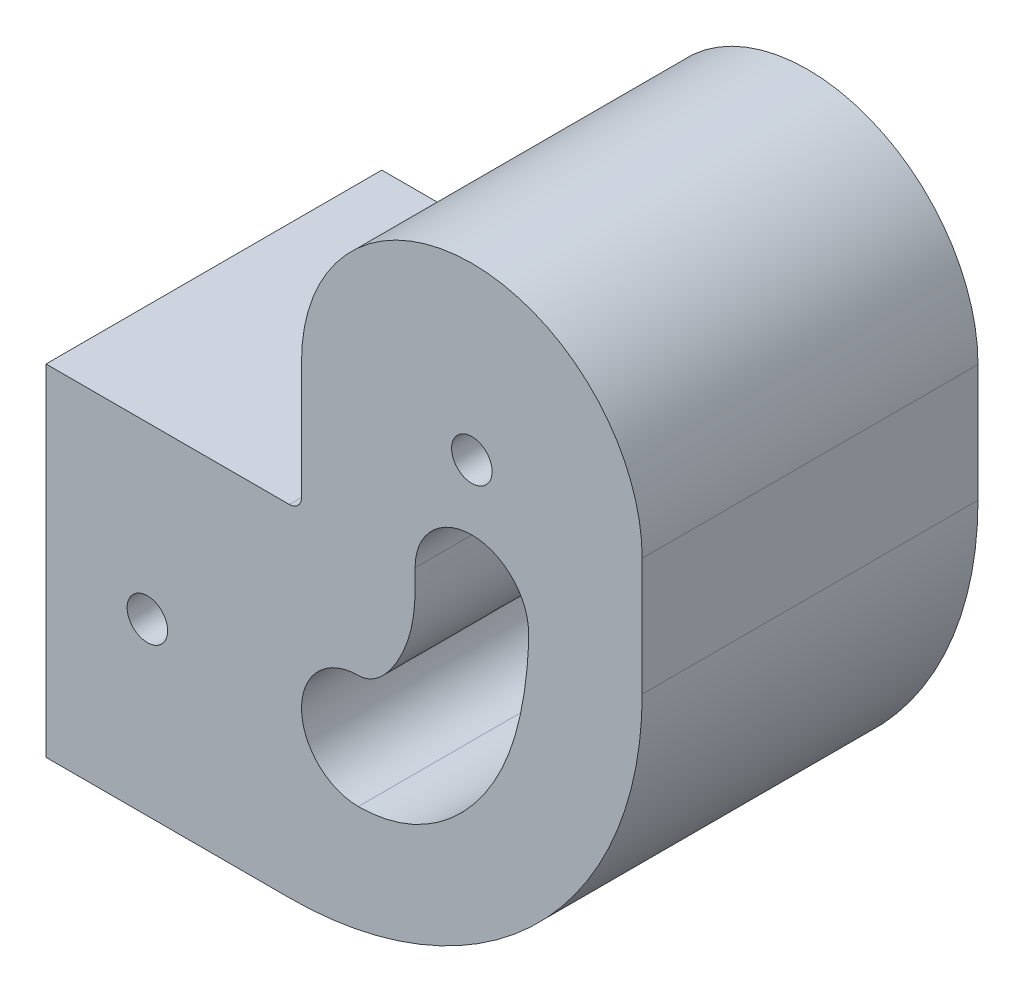
ISO-10303-21;
HEADER;
FILE_DESCRIPTION(('STEP AP214'),'2;1');
FILE_NAME('part.step','',(''),(''),'','','');
FILE_SCHEMA(('AUTOMOTIVE_DESIGN { 1 0 10303 214 1 1 1 1 }'));
ENDSEC;
DATA;
#1=APPLICATION_CONTEXT('core data for automotive mechanical design processes');
#2=APPLICATION_PROTOCOL_DEFINITION('international standard','automotive_design',2000,#1);
#3=PRODUCT_CONTEXT('',#1,'mechanical');
#4=PRODUCT('Part','Part','',(#3));
#5=PRODUCT_RELATED_PRODUCT_CATEGORY('part','',(#4));
#6=PRODUCT_DEFINITION_FORMATION('','',#4);
#7=PRODUCT_DEFINITION_CONTEXT('part definition',#1,'design');
#8=PRODUCT_DEFINITION('design','',#6,#7);
#9=PRODUCT_DEFINITION_SHAPE('','',#8);
#10=(LENGTH_UNIT() NAMED_UNIT(*) SI_UNIT(.MILLI.,.METRE.));
#11=(NAMED_UNIT(*) PLANE_ANGLE_UNIT() SI_UNIT($,.RADIAN.));
#12=(NAMED_UNIT(*) SI_UNIT($,.STERADIAN.) SOLID_ANGLE_UNIT());
#13=UNCERTAINTY_MEASURE_WITH_UNIT(LENGTH_MEASURE(1.E-05),#10,'distance_accuracy_value','');
#14=(GEOMETRIC_REPRESENTATION_CONTEXT(3) GLOBAL_UNCERTAINTY_ASSIGNED_CONTEXT((#13)) GLOBAL_UNIT_ASSIGNED_CONTEXT((#10,
#11,#12)) REPRESENTATION_CONTEXT('',''));
#15=CARTESIAN_POINT('',(0.,0.,0.));
#16=DIRECTION('',(0.,0.,1.));
#17=DIRECTION('',(1.,0.,0.));
#18=AXIS2_PLACEMENT_3D('',#15,#16,#17);
#19=CARTESIAN_POINT('',(-9.37448476169282,10.7481097822781,41.4));
#20=DIRECTION('',(0.,0.,-1.));
#21=DIRECTION('',(-1.,0.,0.));
#22=AXIS2_PLACEMENT_3D('',#19,#20,#21);
#23=CYLINDRICAL_SURFACE('',#22,2.5);
#24=CARTESIAN_POINT('',(-9.37448476169282,10.7481097822781,41.4));
#25=DIRECTION('',(0.,0.,1.));
#26=DIRECTION('',(1.,0.,0.));
#27=AXIS2_PLACEMENT_3D('',#24,#25,#26);
#28=CIRCLE('',#27,2.5);
#29=CARTESIAN_POINT('',(-6.87448476169282,10.7481097822781,41.4));
#30=VERTEX_POINT('',#29);
#31=EDGE_CURVE('E222',#30,#30,#28,.T.);
#32=ORIENTED_EDGE('',*,*,#31,.T.);
#33=EDGE_LOOP('',(#32));
#34=FACE_BOUND('',#33,.T.);
#35=CARTESIAN_POINT('',(-9.37448476169282,10.7481097822781,34.1));
#36=DIRECTION('',(0.,0.,-1.));
#37=DIRECTION('',(-1.,0.,0.));
#38=AXIS2_PLACEMENT_3D('',#35,#36,#37);
#39=CIRCLE('',#38,2.5);
#40=CARTESIAN_POINT('',(-11.8744847616928,10.7481097822781,34.1));
#41=VERTEX_POINT('',#40);
#42=EDGE_CURVE('E423',#41,#41,#39,.T.);
#43=ORIENTED_EDGE('',*,*,#42,.T.);
#44=EDGE_LOOP('',(#43));
#45=FACE_BOUND('',#44,.T.);
#46=ADVANCED_FACE('F33',(#34,#45),#23,.F.);
#47=CARTESIAN_POINT('',(-9.37448476169282,10.7481097822781,7.7));
#48=DIRECTION('',(0.,0.,-1.));
#49=DIRECTION('',(0.,1.,0.));
#50=AXIS2_PLACEMENT_3D('',#47,#48,#49);
#51=CIRCLE('',#50,2.5);
#52=CARTESIAN_POINT('',(-9.37448476169282,13.2481097822781,7.7));
#53=VERTEX_POINT('',#52);
#54=EDGE_CURVE('E37',#53,#53,#51,.T.);
#55=ORIENTED_EDGE('',*,*,#54,.F.);
#56=EDGE_LOOP('',(#55));
#57=FACE_BOUND('',#56,.T.);
#58=CARTESIAN_POINT('',(-9.37448476169282,10.7481097822781,0.));
#59=DIRECTION('',(0.,0.,1.));
#60=DIRECTION('',(1.,0.,0.));
#61=AXIS2_PLACEMENT_3D('',#58,#59,#60);
#62=CIRCLE('',#61,2.5);
#63=CARTESIAN_POINT('',(-6.87448476169282,10.7481097822781,0.));
#64=VERTEX_POINT('',#63);
#65=EDGE_CURVE('E218',#64,#64,#62,.T.);
#66=ORIENTED_EDGE('',*,*,#65,.F.);
#67=EDGE_LOOP('',(#66));
#68=FACE_BOUND('',#67,.T.);
#69=ADVANCED_FACE('F331',(#57,#68),#23,.F.);
#70=CARTESIAN_POINT('',(8.12551523830717,33.2481097822781,41.4));
#71=DIRECTION('',(0.,0.,1.));
#72=DIRECTION('',(1.,0.,0.));
#73=AXIS2_PLACEMENT_3D('',#70,#71,#72);
#74=PLANE('',#73);
#75=CARTESIAN_POINT('',(23.6255152383072,32.7481097822781,41.4));
#76=CARTESIAN_POINT('',(23.6255152383072,30.3988147346227,41.4));
#77=CARTESIAN_POINT('',(23.8825667910086,24.826419711627,41.4));
#78=CARTESIAN_POINT('',(19.461751307427,17.7481097822781,41.4));
#79=CARTESIAN_POINT('',(16.6255152383072,17.7481097822781,41.4));
#80=B_SPLINE_CURVE_WITH_KNOTS('',3,(#75,#76,#77,#78,#79),.UNSPECIFIED.,.F.,.F.,(4,1,4),(0.,
0.428336813074137,1.),.UNSPECIFIED.);
#81=CARTESIAN_POINT('',(23.6255152383072,32.7481097822781,41.4));
#82=VERTEX_POINT('',#81);
#83=CARTESIAN_POINT('',(16.6255152383072,17.7481097822781,41.4));
#84=VERTEX_POINT('',#83);
#85=EDGE_CURVE('E49',#82,#84,#80,.T.);
#86=ORIENTED_EDGE('',*,*,#85,.F.);
#87=CARTESIAN_POINT('',(30.6255152383072,32.7481097822781,41.4));
#88=DIRECTION('',(0.,0.,1.));
#89=DIRECTION('',(-1.,0.,0.));
#90=AXIS2_PLACEMENT_3D('',#87,#88,#89);
#91=CIRCLE('',#90,7.);
#92=CARTESIAN_POINT('',(37.6255152383072,32.7481097822781,41.4));
#93=VERTEX_POINT('',#92);
#94=EDGE_CURVE('E166',#93,#82,#91,.T.);
#95=ORIENTED_EDGE('',*,*,#94,.F.);
#96=CARTESIAN_POINT('',(16.6255152383072,3.74810978227806,41.4));
#97=CARTESIAN_POINT('',(24.9405095952387,3.74810978227806,41.4));
#98=CARTESIAN_POINT('',(36.1710874523953,14.120308293446,41.4));
#99=CARTESIAN_POINT('',(37.6255152383072,29.3528395495759,41.4));
#100=CARTESIAN_POINT('',(37.6255152383072,32.7481097822781,41.4));
#101=B_SPLINE_CURVE_WITH_KNOTS('',3,(#96,#97,#98,#99,#100),.UNSPECIFIED.,.F.,.F.,(4,1,4),(0.,
0.619735212235577,1.),.UNSPECIFIED.);
#102=CARTESIAN_POINT('',(16.6255152383072,3.74810978227806,41.4));
#103=VERTEX_POINT('',#102);
#104=EDGE_CURVE('E150',#103,#93,#101,.T.);
#105=ORIENTED_EDGE('',*,*,#104,.F.);
#106=CARTESIAN_POINT('',(16.6255152383072,10.7481097822781,41.4));
#107=DIRECTION('',(0.,0.,1.));
#108=DIRECTION('',(1.,0.,0.));
#109=AXIS2_PLACEMENT_3D('',#106,#107,#108);
#110=CIRCLE('',#109,7.);
#111=EDGE_CURVE('E159',#84,#103,#110,.T.);
#112=ORIENTED_EDGE('',*,*,#111,.F.);
#113=EDGE_LOOP('',(#86,#95,#105,#112));
#114=FACE_BOUND('',#113,.T.);
#115=ORIENTED_EDGE('',*,*,#31,.F.);
#116=EDGE_LOOP('',(#115));
#117=FACE_BOUND('',#116,.T.);
#118=CARTESIAN_POINT('',(8.12551523830717,33.2481097822781,41.4));
#119=DIRECTION('',(0.,0.,-1.));
#120=DIRECTION('',(1.,0.,0.));
#121=AXIS2_PLACEMENT_3D('',#118,#119,#120);
#122=CIRCLE('',#121,1.50000000000002);
#123=CARTESIAN_POINT('',(9.62551523830719,33.2481097822781,41.4));
#124=VERTEX_POINT('',#123);
#125=CARTESIAN_POINT('',(8.12551523830717,31.7481097822781,41.4));
#126=VERTEX_POINT('',#125);
#127=EDGE_CURVE('E228',#124,#126,#122,.T.);
#128=ORIENTED_EDGE('',*,*,#127,.T.);
#129=DIRECTION('',(-1.,0.,0.));
#130=VECTOR('',#129,1.);
#131=CARTESIAN_POINT('',(8.12551523830717,31.7481097822781,41.4));
#132=LINE('',#131,#130);
#133=CARTESIAN_POINT('',(-21.8744847616928,31.7481097822781,41.4));
#134=VERTEX_POINT('',#133);
#135=EDGE_CURVE('E231',#126,#134,#132,.T.);
#136=ORIENTED_EDGE('',*,*,#135,.T.);
#137=DIRECTION('',(0.,-1.,0.));
#138=VECTOR('',#137,1.);
#139=CARTESIAN_POINT('',(-21.8744847616928,31.7481097822781,41.4));
#140=LINE('',#139,#138);
#141=CARTESIAN_POINT('',(-21.8744847616928,-10.2518902177219,41.4));
#142=VERTEX_POINT('',#141);
#143=EDGE_CURVE('E234',#134,#142,#140,.T.);
#144=ORIENTED_EDGE('',*,*,#143,.T.);
#145=DIRECTION('',(1.,0.,0.));
#146=VECTOR('',#145,1.);
#147=CARTESIAN_POINT('',(-21.8744847616928,-10.2518902177219,41.4));
#148=LINE('',#147,#146);
#149=CARTESIAN_POINT('',(8.12551523830718,-10.2518902177219,41.4));
#150=VERTEX_POINT('',#149);
#151=EDGE_CURVE('E236',#142,#150,#148,.T.);
#152=ORIENTED_EDGE('',*,*,#151,.T.);
#153=CARTESIAN_POINT('',(8.12551523830717,33.2481097822781,41.4));
#154=DIRECTION('',(0.,0.,1.));
#155=DIRECTION('',(1.,0.,0.));
#156=AXIS2_PLACEMENT_3D('',#153,#154,#155);
#157=CIRCLE('',#156,43.5);
#158=CARTESIAN_POINT('',(51.6255152383072,33.2481097822781,41.4));
#159=VERTEX_POINT('',#158);
#160=EDGE_CURVE('E238',#150,#159,#157,.T.);
#161=ORIENTED_EDGE('',*,*,#160,.T.);
#162=DIRECTION('',(0.,1.,0.));
#163=VECTOR('',#162,1.);
#164=CARTESIAN_POINT('',(51.6255152383072,47.7481097822781,41.4));
#165=LINE('',#164,#163);
#166=CARTESIAN_POINT('',(51.6255152383072,47.7481097822781,41.4));
#167=VERTEX_POINT('',#166);
#168=EDGE_CURVE('E240',#159,#167,#165,.T.);
#169=ORIENTED_EDGE('',*,*,#168,.T.);
#170=CARTESIAN_POINT('',(30.6255152383072,47.7481097822781,41.4));
#171=DIRECTION('',(0.,0.,1.));
#172=DIRECTION('',(-1.,0.,0.));
#173=AXIS2_PLACEMENT_3D('',#170,#171,#172);
#174=CIRCLE('',#173,21.);
#175=CARTESIAN_POINT('',(9.62551523830718,47.7481097822781,41.4));
#176=VERTEX_POINT('',#175);
#177=EDGE_CURVE('E242',#167,#176,#174,.T.);
#178=ORIENTED_EDGE('',*,*,#177,.T.);
#179=DIRECTION('',(0.,-1.,0.));
#180=VECTOR('',#179,1.);
#181=CARTESIAN_POINT('',(9.62551523830719,47.7481097822781,41.4));
#182=LINE('',#181,#180);
#183=EDGE_CURVE('E244',#176,#124,#182,.T.);
#184=ORIENTED_EDGE('',*,*,#183,.T.);
#185=EDGE_LOOP('',(#128,#136,#144,#152,#161,#169,#178,#184));
#186=FACE_BOUND('',#185,.T.);
#187=CARTESIAN_POINT('',(30.6255152383072,47.7481097822781,41.4));
#188=DIRECTION('',(0.,0.,1.));
#189=DIRECTION('',(1.,0.,0.));
#190=AXIS2_PLACEMENT_3D('',#187,#188,#189);
#191=CIRCLE('',#190,2.5);
#192=CARTESIAN_POINT('',(33.1255152383072,47.7481097822781,41.4));
#193=VERTEX_POINT('',#192);
#194=EDGE_CURVE('E215',#193,#193,#191,.T.);
#195=ORIENTED_EDGE('',*,*,#194,.F.);
#196=EDGE_LOOP('',(#195));
#197=FACE_BOUND('',#196,.T.);
#198=ADVANCED_FACE('F163',(#114,#117,#186,#197),#74,.T.);
#199=CARTESIAN_POINT('',(8.12551523830717,33.2481097822781,0.));
#200=DIRECTION('',(0.,0.,1.));
#201=DIRECTION('',(1.,0.,0.));
#202=AXIS2_PLACEMENT_3D('',#199,#200,#201);
#203=PLANE('',#202);
#204=CARTESIAN_POINT('',(30.6255152383072,32.7481097822781,0.));
#205=DIRECTION('',(0.,0.,1.));
#206=DIRECTION('',(1.,0.,0.));
#207=AXIS2_PLACEMENT_3D('',#204,#205,#206);
#208=CIRCLE('',#207,7.);
#209=CARTESIAN_POINT('',(23.6255152383072,32.7481097822781,0.));
#210=VERTEX_POINT('',#209);
#211=CARTESIAN_POINT('',(37.6255152383072,32.7481097822781,0.));
#212=VERTEX_POINT('',#211);
#213=EDGE_CURVE('E428',#210,#212,#208,.F.);
#214=ORIENTED_EDGE('',*,*,#213,.F.);
#215=CARTESIAN_POINT('',(23.6255152383072,32.7481097822781,0.));
#216=CARTESIAN_POINT('',(23.6255152383072,30.3988147346227,0.));
#217=CARTESIAN_POINT('',(23.8825667910086,24.826419711627,0.));
#218=CARTESIAN_POINT('',(19.461751307427,17.7481097822781,0.));
#219=CARTESIAN_POINT('',(16.6255152383072,17.7481097822781,0.));
#220=B_SPLINE_CURVE_WITH_KNOTS('',3,(#215,#216,#217,#218,#219),.UNSPECIFIED.,.F.,.F.,(4,1,4),
(0.,0.428336813074137,1.),.UNSPECIFIED.);
#221=CARTESIAN_POINT('',(16.6255152383072,17.7481097822781,0.));
#222=VERTEX_POINT('',#221);
#223=EDGE_CURVE('E183',#222,#210,#220,.F.);
#224=ORIENTED_EDGE('',*,*,#223,.F.);
#225=CARTESIAN_POINT('',(16.6255152383072,10.7481097822781,0.));
#226=DIRECTION('',(0.,0.,1.));
#227=DIRECTION('',(1.,0.,0.));
#228=AXIS2_PLACEMENT_3D('',#225,#226,#227);
#229=CIRCLE('',#228,7.);
#230=CARTESIAN_POINT('',(16.6255152383072,3.74810978227806,0.));
#231=VERTEX_POINT('',#230);
#232=EDGE_CURVE('E180',#231,#222,#229,.F.);
#233=ORIENTED_EDGE('',*,*,#232,.F.);
#234=CARTESIAN_POINT('',(16.6255152383072,3.74810978227806,0.));
#235=CARTESIAN_POINT('',(24.9405095952387,3.74810978227806,0.));
#236=CARTESIAN_POINT('',(36.1710874523953,14.120308293446,0.));
#237=CARTESIAN_POINT('',(37.6255152383072,29.3528395495759,0.));
#238=CARTESIAN_POINT('',(37.6255152383072,32.7481097822781,0.));
#239=B_SPLINE_CURVE_WITH_KNOTS('',3,(#234,#235,#236,#237,#238),.UNSPECIFIED.,.F.,.F.,(4,1,4),
(0.,0.619735212235577,1.),.UNSPECIFIED.);
#240=EDGE_CURVE('E153',#212,#231,#239,.F.);
#241=ORIENTED_EDGE('',*,*,#240,.F.);
#242=EDGE_LOOP('',(#214,#224,#233,#241));
#243=FACE_BOUND('',#242,.T.);
#244=CARTESIAN_POINT('',(8.12551523830717,33.2481097822781,0.));
#245=DIRECTION('',(0.,0.,-1.));
#246=DIRECTION('',(1.,0.,0.));
#247=AXIS2_PLACEMENT_3D('',#244,#245,#246);
#248=CIRCLE('',#247,1.50000000000002);
#249=CARTESIAN_POINT('',(9.62551523830719,33.2481097822781,0.));
#250=VERTEX_POINT('',#249);
#251=CARTESIAN_POINT('',(8.12551523830717,31.7481097822781,0.));
#252=VERTEX_POINT('',#251);
#253=EDGE_CURVE('E225',#250,#252,#248,.T.);
#254=ORIENTED_EDGE('',*,*,#253,.F.);
#255=DIRECTION('',(0.,-1.,0.));
#256=VECTOR('',#255,1.);
#257=CARTESIAN_POINT('',(9.62551523830719,47.7481097822781,0.));
#258=LINE('',#257,#256);
#259=CARTESIAN_POINT('',(9.62551523830718,47.7481097822781,0.));
#260=VERTEX_POINT('',#259);
#261=EDGE_CURVE('E232',#260,#250,#258,.T.);
#262=ORIENTED_EDGE('',*,*,#261,.F.);
#263=CARTESIAN_POINT('',(30.6255152383072,47.7481097822781,0.));
#264=DIRECTION('',(0.,0.,1.));
#265=DIRECTION('',(-1.,0.,0.));
#266=AXIS2_PLACEMENT_3D('',#263,#264,#265);
#267=CIRCLE('',#266,21.);
#268=CARTESIAN_POINT('',(51.6255152383072,47.7481097822781,0.));
#269=VERTEX_POINT('',#268);
#270=EDGE_CURVE('E259',#269,#260,#267,.T.);
#271=ORIENTED_EDGE('',*,*,#270,.F.);
#272=DIRECTION('',(0.,1.,0.));
#273=VECTOR('',#272,1.);
#274=CARTESIAN_POINT('',(51.6255152383072,47.7481097822781,0.));
#275=LINE('',#274,#273);
#276=CARTESIAN_POINT('',(51.6255152383072,33.2481097822781,0.));
#277=VERTEX_POINT('',#276);
#278=EDGE_CURVE('E257',#277,#269,#275,.T.);
#279=ORIENTED_EDGE('',*,*,#278,.F.);
#280=CARTESIAN_POINT('',(8.12551523830717,33.2481097822781,0.));
#281=DIRECTION('',(0.,0.,1.));
#282=DIRECTION('',(1.,0.,0.));
#283=AXIS2_PLACEMENT_3D('',#280,#281,#282);
#284=CIRCLE('',#283,43.5);
#285=CARTESIAN_POINT('',(8.12551523830718,-10.2518902177219,0.));
#286=VERTEX_POINT('',#285);
#287=EDGE_CURVE('E255',#286,#277,#284,.T.);
#288=ORIENTED_EDGE('',*,*,#287,.F.);
#289=DIRECTION('',(1.,0.,0.));
#290=VECTOR('',#289,1.);
#291=CARTESIAN_POINT('',(-21.8744847616928,-10.2518902177219,0.));
#292=LINE('',#291,#290);
#293=CARTESIAN_POINT('',(-21.8744847616928,-10.2518902177219,0.));
#294=VERTEX_POINT('',#293);
#295=EDGE_CURVE('E253',#294,#286,#292,.T.);
#296=ORIENTED_EDGE('',*,*,#295,.F.);
#297=DIRECTION('',(0.,-1.,0.));
#298=VECTOR('',#297,1.);
#299=CARTESIAN_POINT('',(-21.8744847616928,31.7481097822781,0.));
#300=LINE('',#299,#298);
#301=CARTESIAN_POINT('',(-21.8744847616928,31.7481097822781,0.));
#302=VERTEX_POINT('',#301);
#303=EDGE_CURVE('E251',#302,#294,#300,.T.);
#304=ORIENTED_EDGE('',*,*,#303,.F.);
#305=DIRECTION('',(-1.,0.,0.));
#306=VECTOR('',#305,1.);
#307=CARTESIAN_POINT('',(8.12551523830717,31.7481097822781,0.));
#308=LINE('',#307,#306);
#309=EDGE_CURVE('E249',#252,#302,#308,.T.);
#310=ORIENTED_EDGE('',*,*,#309,.F.);
#311=EDGE_LOOP('',(#254,#262,#271,#279,#288,#296,#304,#310));
#312=FACE_BOUND('',#311,.T.);
#313=ORIENTED_EDGE('',*,*,#65,.T.);
#314=EDGE_LOOP('',(#313));
#315=FACE_BOUND('',#314,.T.);
#316=CARTESIAN_POINT('',(30.6255152383072,47.7481097822781,0.));
#317=DIRECTION('',(0.,0.,1.));
#318=DIRECTION('',(1.,0.,0.));
#319=AXIS2_PLACEMENT_3D('',#316,#317,#318);
#320=CIRCLE('',#319,2.5);
#321=CARTESIAN_POINT('',(33.1255152383072,47.7481097822781,0.));
#322=VERTEX_POINT('',#321);
#323=EDGE_CURVE('E219',#322,#322,#320,.T.);
#324=ORIENTED_EDGE('',*,*,#323,.T.);
#325=EDGE_LOOP('',(#324));
#326=FACE_BOUND('',#325,.T.);
#327=ADVANCED_FACE('F290',(#243,#312,#315,#326),#203,.F.);
#328=CARTESIAN_POINT('',(8.12551523830717,33.2481097822781,41.4));
#329=DIRECTION('',(0.,0.,-1.));
#330=DIRECTION('',(-1.,0.,0.));
#331=AXIS2_PLACEMENT_3D('',#328,#329,#330);
#332=CYLINDRICAL_SURFACE('',#331,1.50000000000002);
#333=ORIENTED_EDGE('',*,*,#253,.T.);
#334=DIRECTION('',(0.,0.,-1.));
#335=VECTOR('',#334,1.);
#336=CARTESIAN_POINT('',(8.12551523830717,31.7481097822781,41.4));
#337=LINE('',#336,#335);
#338=EDGE_CURVE('E11',#126,#252,#337,.T.);
#339=ORIENTED_EDGE('',*,*,#338,.F.);
#340=ORIENTED_EDGE('',*,*,#127,.F.);
#341=DIRECTION('',(0.,0.,-1.));
#342=VECTOR('',#341,1.);
#343=CARTESIAN_POINT('',(9.62551523830719,33.2481097822781,41.4));
#344=LINE('',#343,#342);
#345=EDGE_CURVE('E246',#124,#250,#344,.T.);
#346=ORIENTED_EDGE('',*,*,#345,.T.);
#347=EDGE_LOOP('',(#333,#339,#340,#346));
#348=FACE_BOUND('',#347,.T.);
#349=ADVANCED_FACE('F35',(#348),#332,.F.);
#350=CARTESIAN_POINT('',(8.12551523830717,31.7481097822781,41.4));
#351=DIRECTION('',(0.,-1.,0.));
#352=DIRECTION('',(1.,0.,0.));
#353=AXIS2_PLACEMENT_3D('',#350,#351,#352);
#354=PLANE('',#353);
#355=ORIENTED_EDGE('',*,*,#309,.T.);
#356=DIRECTION('',(0.,0.,-1.));
#357=VECTOR('',#356,1.);
#358=CARTESIAN_POINT('',(-21.8744847616928,31.7481097822781,41.4));
#359=LINE('',#358,#357);
#360=EDGE_CURVE('E42',#134,#302,#359,.T.);
#361=ORIENTED_EDGE('',*,*,#360,.F.);
#362=ORIENTED_EDGE('',*,*,#135,.F.);
#363=ORIENTED_EDGE('',*,*,#338,.T.);
#364=EDGE_LOOP('',(#355,#361,#362,#363));
#365=FACE_BOUND('',#364,.T.);
#366=ADVANCED_FACE('F308',(#365),#354,.F.);
#367=CARTESIAN_POINT('',(-21.8744847616928,31.7481097822781,41.4));
#368=DIRECTION('',(1.,0.,0.));
#369=DIRECTION('',(0.,1.,0.));
#370=AXIS2_PLACEMENT_3D('',#367,#368,#369);
#371=PLANE('',#370);
#372=DIRECTION('',(0.,0.,1.));
#373=VECTOR('',#372,1.);
#374=CARTESIAN_POINT('',(-21.8744847616928,-2.25189021772193,7.7));
#375=LINE('',#374,#373);
#376=CARTESIAN_POINT('',(-21.8744847616928,-2.25189021772193,7.70000000000001));
#377=VERTEX_POINT('',#376);
#378=CARTESIAN_POINT('',(-21.8744847616928,-2.25189021772193,33.7));
#379=VERTEX_POINT('',#378);
#380=EDGE_CURVE('E199',#377,#379,#375,.T.);
#381=ORIENTED_EDGE('',*,*,#380,.F.);
#382=DIRECTION('',(0.,-1.,0.));
#383=VECTOR('',#382,1.);
#384=CARTESIAN_POINT('',(-21.8744847616928,23.7481097822781,7.7));
#385=LINE('',#384,#383);
#386=CARTESIAN_POINT('',(-21.8744847616928,23.7481097822781,7.7));
#387=VERTEX_POINT('',#386);
#388=EDGE_CURVE('E182',#387,#377,#385,.T.);
#389=ORIENTED_EDGE('',*,*,#388,.F.);
#390=DIRECTION('',(0.,0.,-1.));
#391=VECTOR('',#390,1.);
#392=CARTESIAN_POINT('',(-21.8744847616928,23.7481097822781,7.7));
#393=LINE('',#392,#391);
#394=CARTESIAN_POINT('',(-21.8744847616928,23.7481097822781,33.7));
#395=VERTEX_POINT('',#394);
#396=EDGE_CURVE('E188',#395,#387,#393,.T.);
#397=ORIENTED_EDGE('',*,*,#396,.F.);
#398=DIRECTION('',(0.,1.,0.));
#399=VECTOR('',#398,1.);
#400=CARTESIAN_POINT('',(-21.8744847616928,23.7481097822781,33.7));
#401=LINE('',#400,#399);
#402=EDGE_CURVE('E202',#379,#395,#401,.T.);
#403=ORIENTED_EDGE('',*,*,#402,.F.);
#404=EDGE_LOOP('',(#381,#389,#397,#403));
#405=FACE_BOUND('',#404,.T.);
#406=ORIENTED_EDGE('',*,*,#303,.T.);
#407=DIRECTION('',(0.,0.,-1.));
#408=VECTOR('',#407,1.);
#409=CARTESIAN_POINT('',(-21.8744847616928,-10.2518902177219,41.4));
#410=LINE('',#409,#408);
#411=EDGE_CURVE('E276',#142,#294,#410,.T.);
#412=ORIENTED_EDGE('',*,*,#411,.F.);
#413=ORIENTED_EDGE('',*,*,#143,.F.);
#414=ORIENTED_EDGE('',*,*,#360,.T.);
#415=EDGE_LOOP('',(#406,#412,#413,#414));
#416=FACE_BOUND('',#415,.T.);
#417=ADVANCED_FACE('F284',(#405,#416),#371,.F.);
#418=CARTESIAN_POINT('',(-21.8744847616928,-10.2518902177219,41.4));
#419=DIRECTION('',(0.,1.,0.));
#420=DIRECTION('',(-1.,0.,0.));
#421=AXIS2_PLACEMENT_3D('',#418,#419,#420);
#422=PLANE('',#421);
#423=ORIENTED_EDGE('',*,*,#295,.T.);
#424=DIRECTION('',(0.,0.,-1.));
#425=VECTOR('',#424,1.);
#426=CARTESIAN_POINT('',(8.12551523830718,-10.2518902177219,41.4));
#427=LINE('',#426,#425);
#428=EDGE_CURVE('E273',#150,#286,#427,.T.);
#429=ORIENTED_EDGE('',*,*,#428,.F.);
#430=ORIENTED_EDGE('',*,*,#151,.F.);
#431=ORIENTED_EDGE('',*,*,#411,.T.);
#432=EDGE_LOOP('',(#423,#429,#430,#431));
#433=FACE_BOUND('',#432,.T.);
#434=ADVANCED_FACE('F296',(#433),#422,.F.);
#435=CARTESIAN_POINT('',(8.12551523830717,33.2481097822781,41.4));
#436=DIRECTION('',(0.,0.,-1.));
#437=DIRECTION('',(-1.,0.,0.));
#438=AXIS2_PLACEMENT_3D('',#435,#436,#437);
#439=CYLINDRICAL_SURFACE('',#438,43.5);
#440=ORIENTED_EDGE('',*,*,#287,.T.);
#441=DIRECTION('',(0.,0.,-1.));
#442=VECTOR('',#441,1.);
#443=CARTESIAN_POINT('',(51.6255152383072,33.2481097822781,41.4));
#444=LINE('',#443,#442);
#445=EDGE_CURVE('E270',#159,#277,#444,.T.);
#446=ORIENTED_EDGE('',*,*,#445,.F.);
#447=ORIENTED_EDGE('',*,*,#160,.F.);
#448=ORIENTED_EDGE('',*,*,#428,.T.);
#449=EDGE_LOOP('',(#440,#446,#447,#448));
#450=FACE_BOUND('',#449,.T.);
#451=ADVANCED_FACE('F300',(#450),#439,.T.);
#452=CARTESIAN_POINT('',(51.6255152383072,47.7481097822781,41.4));
#453=DIRECTION('',(-1.,0.,0.));
#454=DIRECTION('',(0.,0.,1.));
#455=AXIS2_PLACEMENT_3D('',#452,#453,#454);
#456=PLANE('',#455);
#457=ORIENTED_EDGE('',*,*,#278,.T.);
#458=DIRECTION('',(0.,0.,-1.));
#459=VECTOR('',#458,1.);
#460=CARTESIAN_POINT('',(51.6255152383072,47.7481097822781,41.4));
#461=LINE('',#460,#459);
#462=EDGE_CURVE('E267',#167,#269,#461,.T.);
#463=ORIENTED_EDGE('',*,*,#462,.F.);
#464=ORIENTED_EDGE('',*,*,#168,.F.);
#465=ORIENTED_EDGE('',*,*,#445,.T.);
#466=EDGE_LOOP('',(#457,#463,#464,#465));
#467=FACE_BOUND('',#466,.T.);
#468=ADVANCED_FACE('F321',(#467),#456,.F.);
#469=CARTESIAN_POINT('',(30.6255152383072,47.7481097822781,41.4));
#470=DIRECTION('',(0.,0.,-1.));
#471=DIRECTION('',(-1.,0.,0.));
#472=AXIS2_PLACEMENT_3D('',#469,#470,#471);
#473=CYLINDRICAL_SURFACE('',#472,21.);
#474=ORIENTED_EDGE('',*,*,#270,.T.);
#475=DIRECTION('',(0.,0.,-1.));
#476=VECTOR('',#475,1.);
#477=CARTESIAN_POINT('',(9.62551523830718,47.7481097822781,41.4));
#478=LINE('',#477,#476);
#479=EDGE_CURVE('E264',#176,#260,#478,.T.);
#480=ORIENTED_EDGE('',*,*,#479,.F.);
#481=ORIENTED_EDGE('',*,*,#177,.F.);
#482=ORIENTED_EDGE('',*,*,#462,.T.);
#483=EDGE_LOOP('',(#474,#480,#481,#482));
#484=FACE_BOUND('',#483,.T.);
#485=ADVANCED_FACE('F319',(#484),#473,.T.);
#486=CARTESIAN_POINT('',(9.62551523830719,47.7481097822781,41.4));
#487=DIRECTION('',(1.,0.,0.));
#488=DIRECTION('',(0.,0.,-1.));
#489=AXIS2_PLACEMENT_3D('',#486,#487,#488);
#490=PLANE('',#489);
#491=ORIENTED_EDGE('',*,*,#261,.T.);
#492=ORIENTED_EDGE('',*,*,#345,.F.);
#493=ORIENTED_EDGE('',*,*,#183,.F.);
#494=ORIENTED_EDGE('',*,*,#479,.T.);
#495=EDGE_LOOP('',(#491,#492,#493,#494));
#496=FACE_BOUND('',#495,.T.);
#497=ADVANCED_FACE('F314',(#496),#490,.F.);
#498=CARTESIAN_POINT('',(30.6255152383072,47.7481097822781,41.4));
#499=DIRECTION('',(0.,0.,-1.));
#500=DIRECTION('',(-1.,0.,0.));
#501=AXIS2_PLACEMENT_3D('',#498,#499,#500);
#502=CYLINDRICAL_SURFACE('',#501,2.5);
#503=ORIENTED_EDGE('',*,*,#194,.T.);
#504=EDGE_LOOP('',(#503));
#505=FACE_BOUND('',#504,.T.);
#506=ORIENTED_EDGE('',*,*,#323,.F.);
#507=EDGE_LOOP('',(#506));
#508=FACE_BOUND('',#507,.T.);
#509=ADVANCED_FACE('F343',(#505,#508),#502,.F.);
#510=CARTESIAN_POINT('',(9.12551523830718,23.7481097822781,7.7));
#511=DIRECTION('',(0.,0.,-1.));
#512=DIRECTION('',(0.,1.,0.));
#513=AXIS2_PLACEMENT_3D('',#510,#511,#512);
#514=PLANE('',#513);
#515=ORIENTED_EDGE('',*,*,#54,.T.);
#516=EDGE_LOOP('',(#515));
#517=FACE_BOUND('',#516,.T.);
#518=ORIENTED_EDGE('',*,*,#388,.T.);
#519=DIRECTION('',(-1.,0.,0.));
#520=VECTOR('',#519,1.);
#521=CARTESIAN_POINT('',(9.12551523830718,-2.25189021772193,7.7));
#522=LINE('',#521,#520);
#523=CARTESIAN_POINT('',(9.12551523830718,-2.25189021772193,7.7));
#524=VERTEX_POINT('',#523);
#525=EDGE_CURVE('E197',#524,#377,#522,.T.);
#526=ORIENTED_EDGE('',*,*,#525,.F.);
#527=DIRECTION('',(0.,-1.,0.));
#528=VECTOR('',#527,1.);
#529=CARTESIAN_POINT('',(9.12551523830718,23.7481097822781,7.7));
#530=LINE('',#529,#528);
#531=CARTESIAN_POINT('',(9.12551523830718,23.7481097822781,7.7));
#532=VERTEX_POINT('',#531);
#533=EDGE_CURVE('E184',#532,#524,#530,.T.);
#534=ORIENTED_EDGE('',*,*,#533,.F.);
#535=DIRECTION('',(-1.,0.,0.));
#536=VECTOR('',#535,1.);
#537=CARTESIAN_POINT('',(9.12551523830718,23.7481097822781,7.7));
#538=LINE('',#537,#536);
#539=EDGE_CURVE('E207',#532,#387,#538,.T.);
#540=ORIENTED_EDGE('',*,*,#539,.T.);
#541=EDGE_LOOP('',(#518,#526,#534,#540));
#542=FACE_BOUND('',#541,.T.);
#543=ADVANCED_FACE('F354',(#517,#542),#514,.F.);
#544=CARTESIAN_POINT('',(9.12551523830718,23.7481097822781,7.7));
#545=DIRECTION('',(0.,1.,0.));
#546=DIRECTION('',(-1.,0.,0.));
#547=AXIS2_PLACEMENT_3D('',#544,#545,#546);
#548=PLANE('',#547);
#549=ORIENTED_EDGE('',*,*,#396,.T.);
#550=ORIENTED_EDGE('',*,*,#539,.F.);
#551=DIRECTION('',(0.,0.,-1.));
#552=VECTOR('',#551,1.);
#553=CARTESIAN_POINT('',(9.12551523830718,23.7481097822781,7.7));
#554=LINE('',#553,#552);
#555=CARTESIAN_POINT('',(9.12551523830718,23.7481097822781,33.7));
#556=VERTEX_POINT('',#555);
#557=EDGE_CURVE('E194',#556,#532,#554,.T.);
#558=ORIENTED_EDGE('',*,*,#557,.F.);
#559=DIRECTION('',(-1.,0.,0.));
#560=VECTOR('',#559,1.);
#561=CARTESIAN_POINT('',(9.12551523830718,23.7481097822781,33.7));
#562=LINE('',#561,#560);
#563=EDGE_CURVE('E209',#556,#395,#562,.T.);
#564=ORIENTED_EDGE('',*,*,#563,.T.);
#565=EDGE_LOOP('',(#549,#550,#558,#564));
#566=FACE_BOUND('',#565,.T.);
#567=ADVANCED_FACE('F359',(#566),#548,.F.);
#568=CARTESIAN_POINT('',(9.12551523830718,23.7481097822781,33.7));
#569=DIRECTION('',(0.,0.,1.));
#570=DIRECTION('',(1.,0.,0.));
#571=AXIS2_PLACEMENT_3D('',#568,#569,#570);
#572=PLANE('',#571);
#573=ORIENTED_EDGE('',*,*,#402,.T.);
#574=ORIENTED_EDGE('',*,*,#563,.F.);
#575=DIRECTION('',(0.,1.,0.));
#576=VECTOR('',#575,1.);
#577=CARTESIAN_POINT('',(9.12551523830718,23.7481097822781,33.7));
#578=LINE('',#577,#576);
#579=CARTESIAN_POINT('',(9.12551523830718,-2.25189021772193,33.7));
#580=VERTEX_POINT('',#579);
#581=EDGE_CURVE('E191',#580,#556,#578,.T.);
#582=ORIENTED_EDGE('',*,*,#581,.F.);
#583=DIRECTION('',(-1.,0.,0.));
#584=VECTOR('',#583,1.);
#585=CARTESIAN_POINT('',(9.12551523830718,-2.25189021772193,33.7));
#586=LINE('',#585,#584);
#587=EDGE_CURVE('E211',#580,#379,#586,.T.);
#588=ORIENTED_EDGE('',*,*,#587,.T.);
#589=EDGE_LOOP('',(#573,#574,#582,#588));
#590=FACE_BOUND('',#589,.T.);
#591=ADVANCED_FACE('F368',(#590),#572,.F.);
#592=CARTESIAN_POINT('',(9.12551523830718,-2.25189021772193,7.7));
#593=DIRECTION('',(0.,-1.,0.));
#594=DIRECTION('',(1.,0.,0.));
#595=AXIS2_PLACEMENT_3D('',#592,#593,#594);
#596=PLANE('',#595);
#597=ORIENTED_EDGE('',*,*,#380,.T.);
#598=ORIENTED_EDGE('',*,*,#587,.F.);
#599=DIRECTION('',(0.,0.,1.));
#600=VECTOR('',#599,1.);
#601=CARTESIAN_POINT('',(9.12551523830718,-2.25189021772193,7.7));
#602=LINE('',#601,#600);
#603=EDGE_CURVE('E187',#524,#580,#602,.T.);
#604=ORIENTED_EDGE('',*,*,#603,.F.);
#605=ORIENTED_EDGE('',*,*,#525,.T.);
#606=EDGE_LOOP('',(#597,#598,#604,#605));
#607=FACE_BOUND('',#606,.T.);
#608=ADVANCED_FACE('F374',(#607),#596,.F.);
#609=CARTESIAN_POINT('',(9.12551523830718,0.,0.));
#610=DIRECTION('',(-1.,0.,0.));
#611=DIRECTION('',(0.,-1.,0.));
#612=AXIS2_PLACEMENT_3D('',#609,#610,#611);
#613=PLANE('',#612);
#614=ORIENTED_EDGE('',*,*,#533,.T.);
#615=ORIENTED_EDGE('',*,*,#603,.T.);
#616=ORIENTED_EDGE('',*,*,#581,.T.);
#617=ORIENTED_EDGE('',*,*,#557,.T.);
#618=EDGE_LOOP('',(#614,#615,#616,#617));
#619=FACE_BOUND('',#618,.T.);
#620=ADVANCED_FACE('F377',(#619),#613,.T.);
#621=CARTESIAN_POINT('',(23.6255152383072,32.7481097822781,-45.6070170039656));
#622=CARTESIAN_POINT('',(23.6255152383072,30.3988147346227,-45.6070170039656));
#623=CARTESIAN_POINT('',(23.8825667910086,24.826419711627,-45.6070170039656));
#624=CARTESIAN_POINT('',(19.461751307427,17.7481097822781,-45.6070170039656));
#625=CARTESIAN_POINT('',(16.6255152383072,17.7481097822781,-45.6070170039656));
#626=B_SPLINE_CURVE_WITH_KNOTS('',3,(#621,#622,#623,#624,#625),.UNSPECIFIED.,.F.,.F.,(4,1,4),
(0.,0.428336813074137,1.),.UNSPECIFIED.);
#627=DIRECTION('',(0.,0.,1.));
#628=VECTOR('',#627,1.);
#629=SURFACE_OF_LINEAR_EXTRUSION('',#626,#628);
#630=ORIENTED_EDGE('',*,*,#223,.T.);
#631=DIRECTION('',(0.,0.,1.));
#632=VECTOR('',#631,1.);
#633=CARTESIAN_POINT('',(23.6255152383072,32.7481097822781,-45.6070170039656));
#634=LINE('',#633,#632);
#635=EDGE_CURVE('E176',#210,#82,#634,.T.);
#636=ORIENTED_EDGE('',*,*,#635,.T.);
#637=ORIENTED_EDGE('',*,*,#85,.T.);
#638=DIRECTION('',(0.,0.,1.));
#639=VECTOR('',#638,1.);
#640=CARTESIAN_POINT('',(16.6255152383072,17.7481097822781,-45.6070170039656));
#641=LINE('',#640,#639);
#642=EDGE_CURVE('E156',#222,#84,#641,.T.);
#643=ORIENTED_EDGE('',*,*,#642,.F.);
#644=EDGE_LOOP('',(#630,#636,#637,#643));
#645=FACE_BOUND('',#644,.T.);
#646=ADVANCED_FACE('F384',(#645),#629,.F.);
#647=CARTESIAN_POINT('',(30.6255152383072,32.7481097822781,-45.6070170039656));
#648=DIRECTION('',(0.,0.,1.));
#649=DIRECTION('',(1.,0.,0.));
#650=AXIS2_PLACEMENT_3D('',#647,#648,#649);
#651=CYLINDRICAL_SURFACE('',#650,7.);
#652=ORIENTED_EDGE('',*,*,#213,.T.);
#653=DIRECTION('',(0.,0.,1.));
#654=VECTOR('',#653,1.);
#655=CARTESIAN_POINT('',(37.6255152383072,32.7481097822781,-45.6070170039656));
#656=LINE('',#655,#654);
#657=EDGE_CURVE('E155',#212,#93,#656,.T.);
#658=ORIENTED_EDGE('',*,*,#657,.T.);
#659=ORIENTED_EDGE('',*,*,#94,.T.);
#660=ORIENTED_EDGE('',*,*,#635,.F.);
#661=EDGE_LOOP('',(#652,#658,#659,#660));
#662=FACE_BOUND('',#661,.T.);
#663=ADVANCED_FACE('F389',(#662),#651,.F.);
#664=CARTESIAN_POINT('',(16.6255152383072,3.74810978227806,-45.6070170039656));
#665=CARTESIAN_POINT('',(24.9405095952387,3.74810978227806,-45.6070170039656));
#666=CARTESIAN_POINT('',(36.1710874523953,14.120308293446,-45.6070170039656));
#667=CARTESIAN_POINT('',(37.6255152383072,29.3528395495759,-45.6070170039656));
#668=CARTESIAN_POINT('',(37.6255152383072,32.7481097822781,-45.6070170039656));
#669=B_SPLINE_CURVE_WITH_KNOTS('',3,(#664,#665,#666,#667,#668),.UNSPECIFIED.,.F.,.F.,(4,1,4),
(0.,0.619735212235577,1.),.UNSPECIFIED.);
#670=DIRECTION('',(0.,0.,1.));
#671=VECTOR('',#670,1.);
#672=SURFACE_OF_LINEAR_EXTRUSION('',#669,#671);
#673=ORIENTED_EDGE('',*,*,#240,.T.);
#674=DIRECTION('',(0.,0.,1.));
#675=VECTOR('',#674,1.);
#676=CARTESIAN_POINT('',(16.6255152383072,3.74810978227806,-45.6070170039656));
#677=LINE('',#676,#675);
#678=EDGE_CURVE('E57',#231,#103,#677,.T.);
#679=ORIENTED_EDGE('',*,*,#678,.T.);
#680=ORIENTED_EDGE('',*,*,#104,.T.);
#681=ORIENTED_EDGE('',*,*,#657,.F.);
#682=EDGE_LOOP('',(#673,#679,#680,#681));
#683=FACE_BOUND('',#682,.T.);
#684=ADVANCED_FACE('F147',(#683),#672,.F.);
#685=CARTESIAN_POINT('',(16.6255152383072,10.7481097822781,-45.6070170039656));
#686=DIRECTION('',(0.,0.,1.));
#687=DIRECTION('',(1.,0.,0.));
#688=AXIS2_PLACEMENT_3D('',#685,#686,#687);
#689=CYLINDRICAL_SURFACE('',#688,7.);
#690=ORIENTED_EDGE('',*,*,#232,.T.);
#691=ORIENTED_EDGE('',*,*,#642,.T.);
#692=ORIENTED_EDGE('',*,*,#111,.T.);
#693=ORIENTED_EDGE('',*,*,#678,.F.);
#694=EDGE_LOOP('',(#690,#691,#692,#693));
#695=FACE_BOUND('',#694,.T.);
#696=ADVANCED_FACE('F160',(#695),#689,.F.);
#697=CARTESIAN_POINT('',(-9.37448476169282,10.7481097822781,34.1));
#698=DIRECTION('',(0.,0.,-1.));
#699=DIRECTION('',(-1.,0.,0.));
#700=AXIS2_PLACEMENT_3D('',#697,#698,#699);
#701=PLANE('',#700);
#702=ORIENTED_EDGE('',*,*,#42,.F.);
#703=EDGE_LOOP('',(#702));
#704=FACE_BOUND('',#703,.T.);
#705=ADVANCED_FACE('F415',(#704),#701,.F.);
#706=CLOSED_SHELL('',(#46,#69,#198,#327,#349,#366,#417,#434,#451,#468,#485,#497,#509,#543,#567,
#591,#608,#620,#646,#663,#684,#696,#705));
#707=MANIFOLD_SOLID_BREP('B2',#706);
#708=ADVANCED_BREP_SHAPE_REPRESENTATION('',(#18,#707),#14);
#709=SHAPE_DEFINITION_REPRESENTATION(#9,#708);
ENDSEC;
END-ISO-10303-21;
